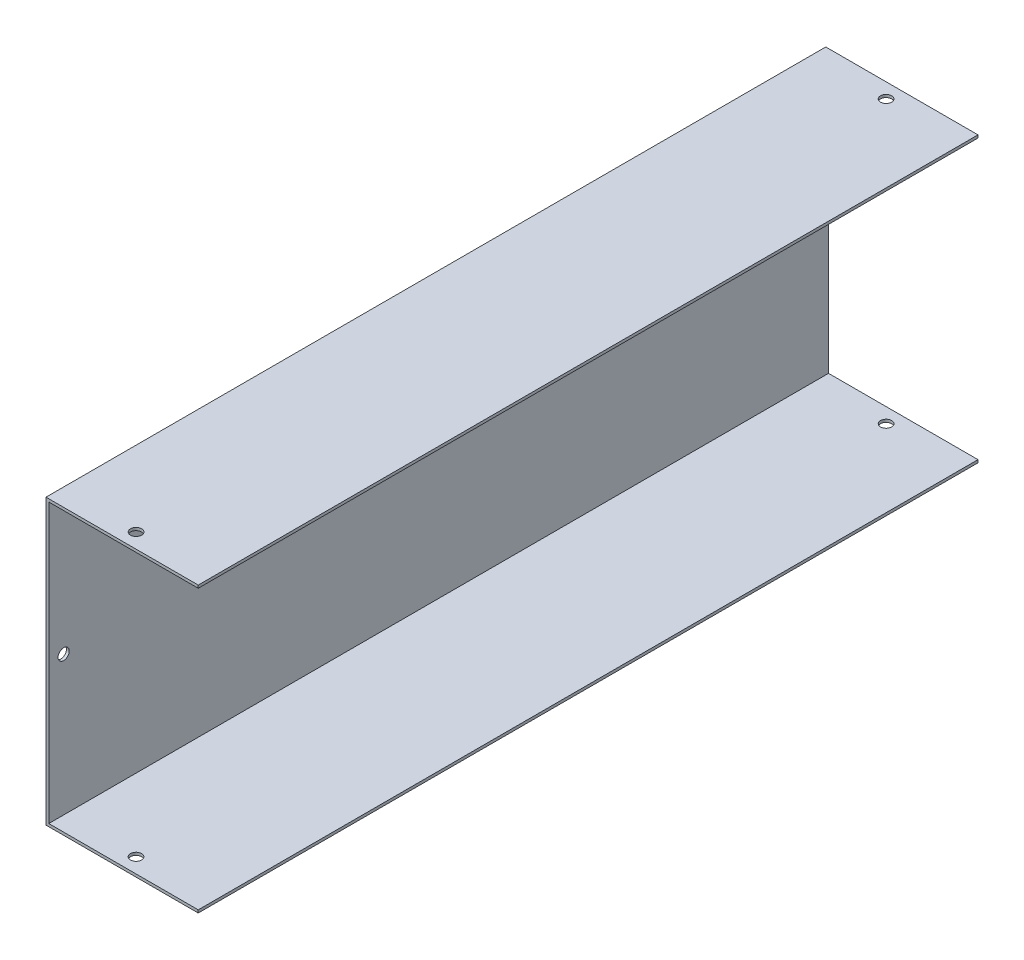
ISO-10303-21;
HEADER;
FILE_DESCRIPTION(('STEP AP214'),'2;1');
FILE_NAME('part.step','',(''),(''),'','','');
FILE_SCHEMA(('AUTOMOTIVE_DESIGN { 1 0 10303 214 1 1 1 1 }'));
ENDSEC;
DATA;
#1=APPLICATION_CONTEXT('core data for automotive mechanical design processes');
#2=APPLICATION_PROTOCOL_DEFINITION('international standard','automotive_design',2000,#1);
#3=PRODUCT_CONTEXT('',#1,'mechanical');
#4=PRODUCT('Part','Part','',(#3));
#5=PRODUCT_RELATED_PRODUCT_CATEGORY('part','',(#4));
#6=PRODUCT_DEFINITION_FORMATION('','',#4);
#7=PRODUCT_DEFINITION_CONTEXT('part definition',#1,'design');
#8=PRODUCT_DEFINITION('design','',#6,#7);
#9=PRODUCT_DEFINITION_SHAPE('','',#8);
#10=(LENGTH_UNIT() NAMED_UNIT(*) SI_UNIT(.MILLI.,.METRE.));
#11=(NAMED_UNIT(*) PLANE_ANGLE_UNIT() SI_UNIT($,.RADIAN.));
#12=(NAMED_UNIT(*) SI_UNIT($,.STERADIAN.) SOLID_ANGLE_UNIT());
#13=UNCERTAINTY_MEASURE_WITH_UNIT(LENGTH_MEASURE(1.E-05),#10,'distance_accuracy_value','');
#14=(GEOMETRIC_REPRESENTATION_CONTEXT(3) GLOBAL_UNCERTAINTY_ASSIGNED_CONTEXT((#13)) GLOBAL_UNIT_ASSIGNED_CONTEXT((#10,
#11,#12)) REPRESENTATION_CONTEXT('',''));
#15=CARTESIAN_POINT('',(0.,0.,0.));
#16=DIRECTION('',(0.,0.,1.));
#17=DIRECTION('',(1.,0.,0.));
#18=AXIS2_PLACEMENT_3D('',#15,#16,#17);
#19=CARTESIAN_POINT('',(41.,-76.5,420.));
#20=DIRECTION('',(-1.,0.,0.));
#21=DIRECTION('',(0.,0.,1.));
#22=AXIS2_PLACEMENT_3D('',#19,#20,#21);
#23=PLANE('',#22);
#24=DIRECTION('',(0.,0.,-1.));
#25=VECTOR('',#24,1.);
#26=CARTESIAN_POINT('',(41.,-75.,420.));
#27=LINE('',#26,#25);
#28=CARTESIAN_POINT('',(41.,-75.,420.));
#29=VERTEX_POINT('',#28);
#30=CARTESIAN_POINT('',(41.,-75.,0.));
#31=VERTEX_POINT('',#30);
#32=EDGE_CURVE('E51',#29,#31,#27,.T.);
#33=ORIENTED_EDGE('',*,*,#32,.F.);
#34=DIRECTION('',(0.,1.,0.));
#35=VECTOR('',#34,1.);
#36=CARTESIAN_POINT('',(41.,-76.5,420.));
#37=LINE('',#36,#35);
#38=CARTESIAN_POINT('',(41.,-76.5,420.));
#39=VERTEX_POINT('',#38);
#40=EDGE_CURVE('E148',#39,#29,#37,.T.);
#41=ORIENTED_EDGE('',*,*,#40,.F.);
#42=DIRECTION('',(0.,0.,-1.));
#43=VECTOR('',#42,1.);
#44=CARTESIAN_POINT('',(41.,-76.5,420.));
#45=LINE('',#44,#43);
#46=CARTESIAN_POINT('',(41.,-76.5,0.));
#47=VERTEX_POINT('',#46);
#48=EDGE_CURVE('E43',#39,#47,#45,.T.);
#49=ORIENTED_EDGE('',*,*,#48,.T.);
#50=DIRECTION('',(0.,1.,0.));
#51=VECTOR('',#50,1.);
#52=CARTESIAN_POINT('',(41.,-76.5,0.));
#53=LINE('',#52,#51);
#54=EDGE_CURVE('E158',#47,#31,#53,.T.);
#55=ORIENTED_EDGE('',*,*,#54,.T.);
#56=EDGE_LOOP('',(#33,#41,#49,#55));
#57=FACE_BOUND('',#56,.T.);
#58=ADVANCED_FACE('F34',(#57),#23,.F.);
#59=CARTESIAN_POINT('',(-41.,-76.5,420.));
#60=DIRECTION('',(1.,0.,0.));
#61=DIRECTION('',(0.,0.,-1.));
#62=AXIS2_PLACEMENT_3D('',#59,#60,#61);
#63=PLANE('',#62);
#64=CARTESIAN_POINT('',(-41.,0.,8.));
#65=DIRECTION('',(-1.,0.,0.));
#66=DIRECTION('',(0.,0.,1.));
#67=AXIS2_PLACEMENT_3D('',#64,#65,#66);
#68=CIRCLE('',#67,3.);
#69=CARTESIAN_POINT('',(-41.,0.,11.));
#70=VERTEX_POINT('',#69);
#71=EDGE_CURVE('E181',#70,#70,#68,.T.);
#72=ORIENTED_EDGE('',*,*,#71,.F.);
#73=EDGE_LOOP('',(#72));
#74=FACE_BOUND('',#73,.T.);
#75=CARTESIAN_POINT('',(-41.,0.,412.));
#76=DIRECTION('',(-1.,0.,0.));
#77=DIRECTION('',(0.,0.,1.));
#78=AXIS2_PLACEMENT_3D('',#75,#76,#77);
#79=CIRCLE('',#78,2.99999999999999);
#80=CARTESIAN_POINT('',(-41.,0.,415.));
#81=VERTEX_POINT('',#80);
#82=EDGE_CURVE('E304',#81,#81,#79,.T.);
#83=ORIENTED_EDGE('',*,*,#82,.F.);
#84=EDGE_LOOP('',(#83));
#85=FACE_BOUND('',#84,.T.);
#86=DIRECTION('',(0.,-1.,0.));
#87=VECTOR('',#86,1.);
#88=CARTESIAN_POINT('',(-41.,-76.5,0.));
#89=LINE('',#88,#87);
#90=CARTESIAN_POINT('',(-41.,76.5,0.));
#91=VERTEX_POINT('',#90);
#92=CARTESIAN_POINT('',(-41.,-76.5,0.));
#93=VERTEX_POINT('',#92);
#94=EDGE_CURVE('E153',#91,#93,#89,.T.);
#95=ORIENTED_EDGE('',*,*,#94,.T.);
#96=DIRECTION('',(0.,0.,-1.));
#97=VECTOR('',#96,1.);
#98=CARTESIAN_POINT('',(-41.,-76.5,420.));
#99=LINE('',#98,#97);
#100=CARTESIAN_POINT('',(-41.,-76.5,420.));
#101=VERTEX_POINT('',#100);
#102=EDGE_CURVE('E11',#101,#93,#99,.T.);
#103=ORIENTED_EDGE('',*,*,#102,.F.);
#104=DIRECTION('',(0.,-1.,0.));
#105=VECTOR('',#104,1.);
#106=CARTESIAN_POINT('',(-41.,-76.5,420.));
#107=LINE('',#106,#105);
#108=CARTESIAN_POINT('',(-41.,76.5,420.));
#109=VERTEX_POINT('',#108);
#110=EDGE_CURVE('E144',#109,#101,#107,.T.);
#111=ORIENTED_EDGE('',*,*,#110,.F.);
#112=DIRECTION('',(0.,0.,-1.));
#113=VECTOR('',#112,1.);
#114=CARTESIAN_POINT('',(-41.,76.5,420.));
#115=LINE('',#114,#113);
#116=EDGE_CURVE('E152',#109,#91,#115,.T.);
#117=ORIENTED_EDGE('',*,*,#116,.T.);
#118=EDGE_LOOP('',(#95,#103,#111,#117));
#119=FACE_BOUND('',#118,.T.);
#120=ADVANCED_FACE('F36',(#74,#85,#119),#63,.F.);
#121=CARTESIAN_POINT('',(41.,-76.5,420.));
#122=DIRECTION('',(0.,1.,0.));
#123=DIRECTION('',(0.,0.,1.));
#124=AXIS2_PLACEMENT_3D('',#121,#122,#123);
#125=PLANE('',#124);
#126=CARTESIAN_POINT('',(-0.499999999999967,-76.5,8.00000000000001));
#127=DIRECTION('',(0.,1.,0.));
#128=DIRECTION('',(0.,0.,1.));
#129=AXIS2_PLACEMENT_3D('',#126,#127,#128);
#130=CIRCLE('',#129,3.);
#131=CARTESIAN_POINT('',(-0.499999999999967,-76.5,11.));
#132=VERTEX_POINT('',#131);
#133=EDGE_CURVE('E129',#132,#132,#130,.T.);
#134=ORIENTED_EDGE('',*,*,#133,.T.);
#135=EDGE_LOOP('',(#134));
#136=FACE_BOUND('',#135,.T.);
#137=CARTESIAN_POINT('',(-0.499999999999967,-76.5,412.));
#138=DIRECTION('',(0.,1.,0.));
#139=DIRECTION('',(0.,0.,1.));
#140=AXIS2_PLACEMENT_3D('',#137,#138,#139);
#141=CIRCLE('',#140,3.);
#142=CARTESIAN_POINT('',(-0.499999999999967,-76.5,415.));
#143=VERTEX_POINT('',#142);
#144=EDGE_CURVE('E173',#143,#143,#141,.T.);
#145=ORIENTED_EDGE('',*,*,#144,.T.);
#146=EDGE_LOOP('',(#145));
#147=FACE_BOUND('',#146,.T.);
#148=DIRECTION('',(1.,0.,0.));
#149=VECTOR('',#148,1.);
#150=CARTESIAN_POINT('',(41.,-76.5,0.));
#151=LINE('',#150,#149);
#152=EDGE_CURVE('E156',#93,#47,#151,.T.);
#153=ORIENTED_EDGE('',*,*,#152,.T.);
#154=ORIENTED_EDGE('',*,*,#48,.F.);
#155=DIRECTION('',(1.,0.,0.));
#156=VECTOR('',#155,1.);
#157=CARTESIAN_POINT('',(41.,-76.5,420.));
#158=LINE('',#157,#156);
#159=EDGE_CURVE('E88',#101,#39,#158,.T.);
#160=ORIENTED_EDGE('',*,*,#159,.F.);
#161=ORIENTED_EDGE('',*,*,#102,.T.);
#162=EDGE_LOOP('',(#153,#154,#160,#161));
#163=FACE_BOUND('',#162,.T.);
#164=ADVANCED_FACE('F196',(#136,#147,#163),#125,.F.);
#165=CARTESIAN_POINT('',(41.,75.,420.));
#166=VERTEX_POINT('',#165);
#167=CARTESIAN_POINT('',(41.,76.5,420.));
#168=VERTEX_POINT('',#167);
#169=EDGE_CURVE('E147',#166,#168,#37,.T.);
#170=ORIENTED_EDGE('',*,*,#169,.F.);
#171=DIRECTION('',(0.,0.,-1.));
#172=VECTOR('',#171,1.);
#173=CARTESIAN_POINT('',(41.,75.,420.));
#174=LINE('',#173,#172);
#175=CARTESIAN_POINT('',(41.,75.,0.));
#176=VERTEX_POINT('',#175);
#177=EDGE_CURVE('E119',#166,#176,#174,.T.);
#178=ORIENTED_EDGE('',*,*,#177,.T.);
#179=CARTESIAN_POINT('',(41.,76.5,0.));
#180=VERTEX_POINT('',#179);
#181=EDGE_CURVE('E133',#176,#180,#53,.T.);
#182=ORIENTED_EDGE('',*,*,#181,.T.);
#183=DIRECTION('',(0.,0.,-1.));
#184=VECTOR('',#183,1.);
#185=CARTESIAN_POINT('',(41.,76.5,420.));
#186=LINE('',#185,#184);
#187=EDGE_CURVE('E163',#168,#180,#186,.T.);
#188=ORIENTED_EDGE('',*,*,#187,.F.);
#189=EDGE_LOOP('',(#170,#178,#182,#188));
#190=FACE_BOUND('',#189,.T.);
#191=ADVANCED_FACE('F221',(#190),#23,.F.);
#192=CARTESIAN_POINT('',(41.,76.5,420.));
#193=DIRECTION('',(0.,-1.,0.));
#194=DIRECTION('',(1.,0.,0.));
#195=AXIS2_PLACEMENT_3D('',#192,#193,#194);
#196=PLANE('',#195);
#197=CARTESIAN_POINT('',(-0.499999999999993,76.5,8.00000000000001));
#198=DIRECTION('',(0.,1.,0.));
#199=DIRECTION('',(-1.,0.,0.));
#200=AXIS2_PLACEMENT_3D('',#197,#198,#199);
#201=CIRCLE('',#200,3.);
#202=CARTESIAN_POINT('',(-3.49999999999999,76.5,8.00000000000001));
#203=VERTEX_POINT('',#202);
#204=EDGE_CURVE('E169',#203,#203,#201,.T.);
#205=ORIENTED_EDGE('',*,*,#204,.F.);
#206=EDGE_LOOP('',(#205));
#207=FACE_BOUND('',#206,.T.);
#208=CARTESIAN_POINT('',(-0.499999999999993,76.5,412.));
#209=DIRECTION('',(0.,1.,0.));
#210=DIRECTION('',(1.,0.,0.));
#211=AXIS2_PLACEMENT_3D('',#208,#209,#210);
#212=CIRCLE('',#211,3.);
#213=CARTESIAN_POINT('',(2.50000000000001,76.5,412.));
#214=VERTEX_POINT('',#213);
#215=EDGE_CURVE('E176',#214,#214,#212,.T.);
#216=ORIENTED_EDGE('',*,*,#215,.F.);
#217=EDGE_LOOP('',(#216));
#218=FACE_BOUND('',#217,.T.);
#219=DIRECTION('',(-1.,0.,0.));
#220=VECTOR('',#219,1.);
#221=CARTESIAN_POINT('',(41.,76.5,0.));
#222=LINE('',#221,#220);
#223=EDGE_CURVE('E81',#180,#91,#222,.T.);
#224=ORIENTED_EDGE('',*,*,#223,.T.);
#225=ORIENTED_EDGE('',*,*,#116,.F.);
#226=DIRECTION('',(-1.,0.,0.));
#227=VECTOR('',#226,1.);
#228=CARTESIAN_POINT('',(41.,76.5,420.));
#229=LINE('',#228,#227);
#230=EDGE_CURVE('E60',#168,#109,#229,.T.);
#231=ORIENTED_EDGE('',*,*,#230,.F.);
#232=ORIENTED_EDGE('',*,*,#187,.T.);
#233=EDGE_LOOP('',(#224,#225,#231,#232));
#234=FACE_BOUND('',#233,.T.);
#235=ADVANCED_FACE('F228',(#207,#218,#234),#196,.F.);
#236=CARTESIAN_POINT('',(0.,0.,420.));
#237=DIRECTION('',(0.,0.,1.));
#238=DIRECTION('',(1.,0.,0.));
#239=AXIS2_PLACEMENT_3D('',#236,#237,#238);
#240=PLANE('',#239);
#241=DIRECTION('',(1.,0.,0.));
#242=VECTOR('',#241,1.);
#243=CARTESIAN_POINT('',(41.,-75.,420.));
#244=LINE('',#243,#242);
#245=CARTESIAN_POINT('',(-39.5,-75.,420.));
#246=VERTEX_POINT('',#245);
#247=EDGE_CURVE('E136',#246,#29,#244,.T.);
#248=ORIENTED_EDGE('',*,*,#247,.F.);
#249=DIRECTION('',(0.,-1.,0.));
#250=VECTOR('',#249,1.);
#251=CARTESIAN_POINT('',(-39.5,-76.5,420.));
#252=LINE('',#251,#250);
#253=CARTESIAN_POINT('',(-39.5,75.,420.));
#254=VERTEX_POINT('',#253);
#255=EDGE_CURVE('E134',#254,#246,#252,.T.);
#256=ORIENTED_EDGE('',*,*,#255,.F.);
#257=DIRECTION('',(-1.,0.,0.));
#258=VECTOR('',#257,1.);
#259=CARTESIAN_POINT('',(41.,75.,420.));
#260=LINE('',#259,#258);
#261=EDGE_CURVE('E116',#166,#254,#260,.T.);
#262=ORIENTED_EDGE('',*,*,#261,.F.);
#263=ORIENTED_EDGE('',*,*,#169,.T.);
#264=ORIENTED_EDGE('',*,*,#230,.T.);
#265=ORIENTED_EDGE('',*,*,#110,.T.);
#266=ORIENTED_EDGE('',*,*,#159,.T.);
#267=ORIENTED_EDGE('',*,*,#40,.T.);
#268=EDGE_LOOP('',(#248,#256,#262,#263,#264,#265,#266,#267));
#269=FACE_BOUND('',#268,.T.);
#270=ADVANCED_FACE('F234',(#269),#240,.T.);
#271=CARTESIAN_POINT('',(0.,0.,0.));
#272=DIRECTION('',(0.,0.,1.));
#273=DIRECTION('',(1.,0.,0.));
#274=AXIS2_PLACEMENT_3D('',#271,#272,#273);
#275=PLANE('',#274);
#276=ORIENTED_EDGE('',*,*,#181,.F.);
#277=DIRECTION('',(-1.,0.,0.));
#278=VECTOR('',#277,1.);
#279=CARTESIAN_POINT('',(41.,75.,0.));
#280=LINE('',#279,#278);
#281=CARTESIAN_POINT('',(-39.5,75.,0.));
#282=VERTEX_POINT('',#281);
#283=EDGE_CURVE('E113',#176,#282,#280,.T.);
#284=ORIENTED_EDGE('',*,*,#283,.T.);
#285=DIRECTION('',(0.,-1.,0.));
#286=VECTOR('',#285,1.);
#287=CARTESIAN_POINT('',(-39.5,-76.5,0.));
#288=LINE('',#287,#286);
#289=CARTESIAN_POINT('',(-39.5,-75.,0.));
#290=VERTEX_POINT('',#289);
#291=EDGE_CURVE('E123',#282,#290,#288,.T.);
#292=ORIENTED_EDGE('',*,*,#291,.T.);
#293=DIRECTION('',(1.,0.,0.));
#294=VECTOR('',#293,1.);
#295=CARTESIAN_POINT('',(41.,-75.,0.));
#296=LINE('',#295,#294);
#297=EDGE_CURVE('E128',#290,#31,#296,.T.);
#298=ORIENTED_EDGE('',*,*,#297,.T.);
#299=ORIENTED_EDGE('',*,*,#54,.F.);
#300=ORIENTED_EDGE('',*,*,#152,.F.);
#301=ORIENTED_EDGE('',*,*,#94,.F.);
#302=ORIENTED_EDGE('',*,*,#223,.F.);
#303=EDGE_LOOP('',(#276,#284,#292,#298,#299,#300,#301,#302));
#304=FACE_BOUND('',#303,.T.);
#305=ADVANCED_FACE('F132',(#304),#275,.F.);
#306=CARTESIAN_POINT('',(-39.5,-76.5,420.));
#307=DIRECTION('',(1.,0.,0.));
#308=DIRECTION('',(0.,0.,-1.));
#309=AXIS2_PLACEMENT_3D('',#306,#307,#308);
#310=PLANE('',#309);
#311=CARTESIAN_POINT('',(-39.5,0.,8.));
#312=DIRECTION('',(1.,0.,0.));
#313=DIRECTION('',(0.,0.,-1.));
#314=AXIS2_PLACEMENT_3D('',#311,#312,#313);
#315=CIRCLE('',#314,3.);
#316=CARTESIAN_POINT('',(-39.5,0.,5.));
#317=VERTEX_POINT('',#316);
#318=EDGE_CURVE('E300',#317,#317,#315,.F.);
#319=ORIENTED_EDGE('',*,*,#318,.T.);
#320=EDGE_LOOP('',(#319));
#321=FACE_BOUND('',#320,.T.);
#322=CARTESIAN_POINT('',(-39.5,0.,412.));
#323=DIRECTION('',(1.,0.,0.));
#324=DIRECTION('',(0.,0.,-1.));
#325=AXIS2_PLACEMENT_3D('',#322,#323,#324);
#326=CIRCLE('',#325,2.99999999999999);
#327=CARTESIAN_POINT('',(-39.5,0.,409.));
#328=VERTEX_POINT('',#327);
#329=EDGE_CURVE('E184',#328,#328,#326,.F.);
#330=ORIENTED_EDGE('',*,*,#329,.T.);
#331=EDGE_LOOP('',(#330));
#332=FACE_BOUND('',#331,.T.);
#333=ORIENTED_EDGE('',*,*,#291,.F.);
#334=DIRECTION('',(0.,0.,-1.));
#335=VECTOR('',#334,1.);
#336=CARTESIAN_POINT('',(-39.5,75.,420.));
#337=LINE('',#336,#335);
#338=EDGE_CURVE('E109',#254,#282,#337,.T.);
#339=ORIENTED_EDGE('',*,*,#338,.F.);
#340=ORIENTED_EDGE('',*,*,#255,.T.);
#341=DIRECTION('',(0.,0.,-1.));
#342=VECTOR('',#341,1.);
#343=CARTESIAN_POINT('',(-39.5,-75.,420.));
#344=LINE('',#343,#342);
#345=EDGE_CURVE('E126',#246,#290,#344,.T.);
#346=ORIENTED_EDGE('',*,*,#345,.T.);
#347=EDGE_LOOP('',(#333,#339,#340,#346));
#348=FACE_BOUND('',#347,.T.);
#349=ADVANCED_FACE('F124',(#321,#332,#348),#310,.T.);
#350=CARTESIAN_POINT('',(41.,-75.,420.));
#351=DIRECTION('',(0.,1.,0.));
#352=DIRECTION('',(0.,0.,1.));
#353=AXIS2_PLACEMENT_3D('',#350,#351,#352);
#354=PLANE('',#353);
#355=CARTESIAN_POINT('',(-0.499999999999967,-75.,8.00000000000001));
#356=DIRECTION('',(0.,1.,0.));
#357=DIRECTION('',(0.,0.,1.));
#358=AXIS2_PLACEMENT_3D('',#355,#356,#357);
#359=CIRCLE('',#358,3.);
#360=CARTESIAN_POINT('',(-0.499999999999967,-75.,11.));
#361=VERTEX_POINT('',#360);
#362=EDGE_CURVE('E189',#361,#361,#359,.T.);
#363=ORIENTED_EDGE('',*,*,#362,.F.);
#364=EDGE_LOOP('',(#363));
#365=FACE_BOUND('',#364,.T.);
#366=CARTESIAN_POINT('',(-0.499999999999967,-75.,412.));
#367=DIRECTION('',(0.,1.,0.));
#368=DIRECTION('',(0.,0.,1.));
#369=AXIS2_PLACEMENT_3D('',#366,#367,#368);
#370=CIRCLE('',#369,3.);
#371=CARTESIAN_POINT('',(-0.499999999999967,-75.,415.));
#372=VERTEX_POINT('',#371);
#373=EDGE_CURVE('E168',#372,#372,#370,.T.);
#374=ORIENTED_EDGE('',*,*,#373,.F.);
#375=EDGE_LOOP('',(#374));
#376=FACE_BOUND('',#375,.T.);
#377=ORIENTED_EDGE('',*,*,#297,.F.);
#378=ORIENTED_EDGE('',*,*,#345,.F.);
#379=ORIENTED_EDGE('',*,*,#247,.T.);
#380=ORIENTED_EDGE('',*,*,#32,.T.);
#381=EDGE_LOOP('',(#377,#378,#379,#380));
#382=FACE_BOUND('',#381,.T.);
#383=ADVANCED_FACE('F239',(#365,#376,#382),#354,.T.);
#384=CARTESIAN_POINT('',(41.,75.,420.));
#385=DIRECTION('',(0.,-1.,0.));
#386=DIRECTION('',(1.,0.,0.));
#387=AXIS2_PLACEMENT_3D('',#384,#385,#386);
#388=PLANE('',#387);
#389=CARTESIAN_POINT('',(-0.499999999999992,75.,8.00000000000001));
#390=DIRECTION('',(0.,-1.,0.));
#391=DIRECTION('',(1.,0.,0.));
#392=AXIS2_PLACEMENT_3D('',#389,#390,#391);
#393=CIRCLE('',#392,3.);
#394=CARTESIAN_POINT('',(2.50000000000001,75.,8.00000000000001));
#395=VERTEX_POINT('',#394);
#396=EDGE_CURVE('E38',#395,#395,#393,.T.);
#397=ORIENTED_EDGE('',*,*,#396,.F.);
#398=EDGE_LOOP('',(#397));
#399=FACE_BOUND('',#398,.T.);
#400=CARTESIAN_POINT('',(-0.499999999999992,75.,412.));
#401=DIRECTION('',(0.,-1.,0.));
#402=DIRECTION('',(1.,0.,0.));
#403=AXIS2_PLACEMENT_3D('',#400,#401,#402);
#404=CIRCLE('',#403,3.);
#405=CARTESIAN_POINT('',(2.50000000000001,75.,412.));
#406=VERTEX_POINT('',#405);
#407=EDGE_CURVE('E166',#406,#406,#404,.T.);
#408=ORIENTED_EDGE('',*,*,#407,.F.);
#409=EDGE_LOOP('',(#408));
#410=FACE_BOUND('',#409,.T.);
#411=ORIENTED_EDGE('',*,*,#283,.F.);
#412=ORIENTED_EDGE('',*,*,#177,.F.);
#413=ORIENTED_EDGE('',*,*,#261,.T.);
#414=ORIENTED_EDGE('',*,*,#338,.T.);
#415=EDGE_LOOP('',(#411,#412,#413,#414));
#416=FACE_BOUND('',#415,.T.);
#417=ADVANCED_FACE('F111',(#399,#410,#416),#388,.T.);
#418=CARTESIAN_POINT('',(-0.499999999999967,-77.5,412.));
#419=DIRECTION('',(0.,1.,0.));
#420=DIRECTION('',(-1.,0.,0.));
#421=AXIS2_PLACEMENT_3D('',#418,#419,#420);
#422=CYLINDRICAL_SURFACE('',#421,3.);
#423=ORIENTED_EDGE('',*,*,#407,.T.);
#424=EDGE_LOOP('',(#423));
#425=FACE_BOUND('',#424,.T.);
#426=ORIENTED_EDGE('',*,*,#215,.T.);
#427=EDGE_LOOP('',(#426));
#428=FACE_BOUND('',#427,.T.);
#429=ADVANCED_FACE('F215',(#425,#428),#422,.F.);
#430=CARTESIAN_POINT('',(-0.499999999999967,-77.5,8.00000000000001));
#431=DIRECTION('',(0.,1.,0.));
#432=DIRECTION('',(-1.,0.,0.));
#433=AXIS2_PLACEMENT_3D('',#430,#431,#432);
#434=CYLINDRICAL_SURFACE('',#433,3.);
#435=ORIENTED_EDGE('',*,*,#396,.T.);
#436=EDGE_LOOP('',(#435));
#437=FACE_BOUND('',#436,.T.);
#438=ORIENTED_EDGE('',*,*,#204,.T.);
#439=EDGE_LOOP('',(#438));
#440=FACE_BOUND('',#439,.T.);
#441=ADVANCED_FACE('F205',(#437,#440),#434,.F.);
#442=ORIENTED_EDGE('',*,*,#373,.T.);
#443=EDGE_LOOP('',(#442));
#444=FACE_BOUND('',#443,.T.);
#445=ORIENTED_EDGE('',*,*,#144,.F.);
#446=EDGE_LOOP('',(#445));
#447=FACE_BOUND('',#446,.T.);
#448=ADVANCED_FACE('F202',(#444,#447),#422,.F.);
#449=ORIENTED_EDGE('',*,*,#362,.T.);
#450=EDGE_LOOP('',(#449));
#451=FACE_BOUND('',#450,.T.);
#452=ORIENTED_EDGE('',*,*,#133,.F.);
#453=EDGE_LOOP('',(#452));
#454=FACE_BOUND('',#453,.T.);
#455=ADVANCED_FACE('F199',(#451,#454),#434,.F.);
#456=CARTESIAN_POINT('',(41.001,0.,412.));
#457=DIRECTION('',(-1.,0.,0.));
#458=DIRECTION('',(0.,0.,1.));
#459=AXIS2_PLACEMENT_3D('',#456,#457,#458);
#460=CYLINDRICAL_SURFACE('',#459,2.99999999999999);
#461=ORIENTED_EDGE('',*,*,#329,.F.);
#462=EDGE_LOOP('',(#461));
#463=FACE_BOUND('',#462,.T.);
#464=ORIENTED_EDGE('',*,*,#82,.T.);
#465=EDGE_LOOP('',(#464));
#466=FACE_BOUND('',#465,.T.);
#467=ADVANCED_FACE('F201',(#463,#466),#460,.F.);
#468=CARTESIAN_POINT('',(41.001,0.,8.));
#469=DIRECTION('',(-1.,0.,0.));
#470=DIRECTION('',(0.,0.,1.));
#471=AXIS2_PLACEMENT_3D('',#468,#469,#470);
#472=CYLINDRICAL_SURFACE('',#471,3.);
#473=ORIENTED_EDGE('',*,*,#318,.F.);
#474=EDGE_LOOP('',(#473));
#475=FACE_BOUND('',#474,.T.);
#476=ORIENTED_EDGE('',*,*,#71,.T.);
#477=EDGE_LOOP('',(#476));
#478=FACE_BOUND('',#477,.T.);
#479=ADVANCED_FACE('F210',(#475,#478),#472,.F.);
#480=CLOSED_SHELL('',(#58,#120,#164,#191,#235,#270,#305,#349,#383,#417,#429,#441,#448,#455,#467,#479));
#481=MANIFOLD_SOLID_BREP('B2',#480);
#482=ADVANCED_BREP_SHAPE_REPRESENTATION('',(#18,#481),#14);
#483=SHAPE_DEFINITION_REPRESENTATION(#9,#482);
ENDSEC;
END-ISO-10303-21;
